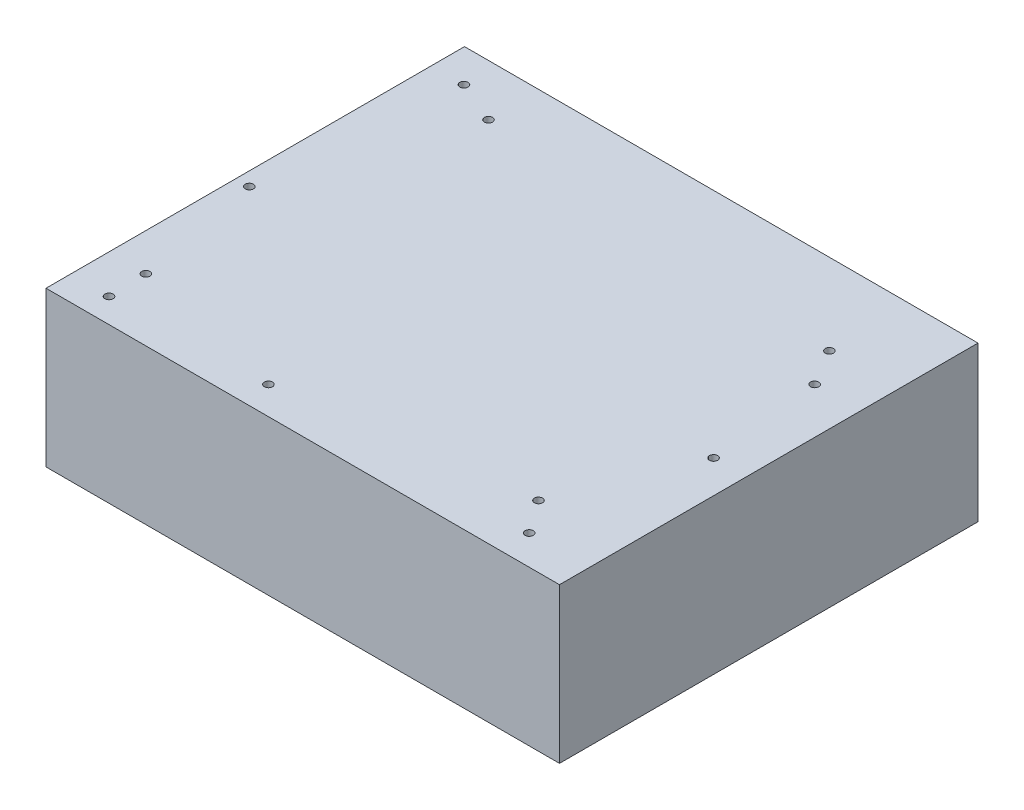
ISO-10303-21;
HEADER;
FILE_DESCRIPTION(('STEP AP214'),'2;1');
FILE_NAME('part.step','',(''),(''),'','','');
FILE_SCHEMA(('AUTOMOTIVE_DESIGN { 1 0 10303 214 1 1 1 1 }'));
ENDSEC;
DATA;
#1=APPLICATION_CONTEXT('core data for automotive mechanical design processes');
#2=APPLICATION_PROTOCOL_DEFINITION('international standard','automotive_design',2000,#1);
#3=PRODUCT_CONTEXT('',#1,'mechanical');
#4=PRODUCT('Part','Part','',(#3));
#5=PRODUCT_RELATED_PRODUCT_CATEGORY('part','',(#4));
#6=PRODUCT_DEFINITION_FORMATION('','',#4);
#7=PRODUCT_DEFINITION_CONTEXT('part definition',#1,'design');
#8=PRODUCT_DEFINITION('design','',#6,#7);
#9=PRODUCT_DEFINITION_SHAPE('','',#8);
#10=(LENGTH_UNIT() NAMED_UNIT(*) SI_UNIT(.MILLI.,.METRE.));
#11=(NAMED_UNIT(*) PLANE_ANGLE_UNIT() SI_UNIT($,.RADIAN.));
#12=(NAMED_UNIT(*) SI_UNIT($,.STERADIAN.) SOLID_ANGLE_UNIT());
#13=UNCERTAINTY_MEASURE_WITH_UNIT(LENGTH_MEASURE(1.E-05),#10,'distance_accuracy_value','');
#14=(GEOMETRIC_REPRESENTATION_CONTEXT(3) GLOBAL_UNCERTAINTY_ASSIGNED_CONTEXT((#13)) GLOBAL_UNIT_ASSIGNED_CONTEXT((#10,
#11,#12)) REPRESENTATION_CONTEXT('',''));
#15=CARTESIAN_POINT('',(0.,0.,0.));
#16=DIRECTION('',(0.,0.,1.));
#17=DIRECTION('',(1.,0.,0.));
#18=AXIS2_PLACEMENT_3D('',#15,#16,#17);
#19=CARTESIAN_POINT('',(-187.5,113.03,-170.));
#20=DIRECTION('',(0.,0.,1.));
#21=DIRECTION('',(1.,0.,0.));
#22=AXIS2_PLACEMENT_3D('',#19,#20,#21);
#23=PLANE('',#22);
#24=DIRECTION('',(-1.,0.,0.));
#25=VECTOR('',#24,1.);
#26=CARTESIAN_POINT('',(-187.5,0.,-170.));
#27=LINE('',#26,#25);
#28=CARTESIAN_POINT('',(187.5,0.,-170.));
#29=VERTEX_POINT('',#28);
#30=CARTESIAN_POINT('',(-187.5,0.,-170.));
#31=VERTEX_POINT('',#30);
#32=EDGE_CURVE('E86',#29,#31,#27,.T.);
#33=ORIENTED_EDGE('',*,*,#32,.T.);
#34=DIRECTION('',(0.,-1.,0.));
#35=VECTOR('',#34,1.);
#36=CARTESIAN_POINT('',(-187.5,113.03,-170.));
#37=LINE('',#36,#35);
#38=CARTESIAN_POINT('',(-187.5,113.03,-170.));
#39=VERTEX_POINT('',#38);
#40=EDGE_CURVE('E40',#39,#31,#37,.T.);
#41=ORIENTED_EDGE('',*,*,#40,.F.);
#42=DIRECTION('',(-1.,0.,0.));
#43=VECTOR('',#42,1.);
#44=CARTESIAN_POINT('',(-187.5,113.03,-170.));
#45=LINE('',#44,#43);
#46=CARTESIAN_POINT('',(187.5,113.03,-170.));
#47=VERTEX_POINT('',#46);
#48=EDGE_CURVE('E78',#47,#39,#45,.T.);
#49=ORIENTED_EDGE('',*,*,#48,.F.);
#50=DIRECTION('',(0.,-1.,0.));
#51=VECTOR('',#50,1.);
#52=CARTESIAN_POINT('',(187.5,113.03,-170.));
#53=LINE('',#52,#51);
#54=EDGE_CURVE('E11',#47,#29,#53,.T.);
#55=ORIENTED_EDGE('',*,*,#54,.T.);
#56=EDGE_LOOP('',(#33,#41,#49,#55));
#57=FACE_BOUND('',#56,.T.);
#58=ADVANCED_FACE('F32',(#57),#23,.F.);
#59=CARTESIAN_POINT('',(-187.5,113.03,-150.));
#60=DIRECTION('',(1.,0.,0.));
#61=DIRECTION('',(0.,0.,-1.));
#62=AXIS2_PLACEMENT_3D('',#59,#60,#61);
#63=PLANE('',#62);
#64=DIRECTION('',(0.,0.,1.));
#65=VECTOR('',#64,1.);
#66=CARTESIAN_POINT('',(-187.5,0.,-150.));
#67=LINE('',#66,#65);
#68=CARTESIAN_POINT('',(-187.5,0.,135.64242453302));
#69=VERTEX_POINT('',#68);
#70=EDGE_CURVE('E65',#31,#69,#67,.T.);
#71=ORIENTED_EDGE('',*,*,#70,.T.);
#72=DIRECTION('',(0.,-1.,0.));
#73=VECTOR('',#72,1.);
#74=CARTESIAN_POINT('',(-187.5,113.03,135.64242453302));
#75=LINE('',#74,#73);
#76=CARTESIAN_POINT('',(-187.5,113.03,135.64242453302));
#77=VERTEX_POINT('',#76);
#78=EDGE_CURVE('E87',#77,#69,#75,.T.);
#79=ORIENTED_EDGE('',*,*,#78,.F.);
#80=DIRECTION('',(0.,0.,1.));
#81=VECTOR('',#80,1.);
#82=CARTESIAN_POINT('',(-187.5,113.03,-150.));
#83=LINE('',#82,#81);
#84=EDGE_CURVE('E82',#39,#77,#83,.T.);
#85=ORIENTED_EDGE('',*,*,#84,.F.);
#86=ORIENTED_EDGE('',*,*,#40,.T.);
#87=EDGE_LOOP('',(#71,#79,#85,#86));
#88=FACE_BOUND('',#87,.T.);
#89=ADVANCED_FACE('F88',(#88),#63,.F.);
#90=CARTESIAN_POINT('',(-187.5,113.03,135.64242453302));
#91=DIRECTION('',(0.,0.,-1.));
#92=DIRECTION('',(-1.,0.,0.));
#93=AXIS2_PLACEMENT_3D('',#90,#91,#92);
#94=PLANE('',#93);
#95=DIRECTION('',(1.,0.,0.));
#96=VECTOR('',#95,1.);
#97=CARTESIAN_POINT('',(-187.5,0.,135.64242453302));
#98=LINE('',#97,#96);
#99=CARTESIAN_POINT('',(187.5,0.,135.64242453302));
#100=VERTEX_POINT('',#99);
#101=EDGE_CURVE('E72',#69,#100,#98,.T.);
#102=ORIENTED_EDGE('',*,*,#101,.T.);
#103=DIRECTION('',(0.,-1.,0.));
#104=VECTOR('',#103,1.);
#105=CARTESIAN_POINT('',(187.5,113.03,135.64242453302));
#106=LINE('',#105,#104);
#107=CARTESIAN_POINT('',(187.5,113.03,135.64242453302));
#108=VERTEX_POINT('',#107);
#109=EDGE_CURVE('E92',#108,#100,#106,.T.);
#110=ORIENTED_EDGE('',*,*,#109,.F.);
#111=DIRECTION('',(1.,0.,0.));
#112=VECTOR('',#111,1.);
#113=CARTESIAN_POINT('',(-187.5,113.03,135.64242453302));
#114=LINE('',#113,#112);
#115=EDGE_CURVE('E90',#77,#108,#114,.T.);
#116=ORIENTED_EDGE('',*,*,#115,.F.);
#117=ORIENTED_EDGE('',*,*,#78,.T.);
#118=EDGE_LOOP('',(#102,#110,#116,#117));
#119=FACE_BOUND('',#118,.T.);
#120=ADVANCED_FACE('F103',(#119),#94,.F.);
#121=CARTESIAN_POINT('',(187.5,113.03,-152.769842225601));
#122=DIRECTION('',(-1.,0.,0.));
#123=DIRECTION('',(0.,0.,1.));
#124=AXIS2_PLACEMENT_3D('',#121,#122,#123);
#125=PLANE('',#124);
#126=DIRECTION('',(0.,0.,-1.));
#127=VECTOR('',#126,1.);
#128=CARTESIAN_POINT('',(187.5,0.,-152.769842225601));
#129=LINE('',#128,#127);
#130=EDGE_CURVE('E100',#100,#29,#129,.T.);
#131=ORIENTED_EDGE('',*,*,#130,.T.);
#132=ORIENTED_EDGE('',*,*,#54,.F.);
#133=DIRECTION('',(0.,0.,-1.));
#134=VECTOR('',#133,1.);
#135=CARTESIAN_POINT('',(187.5,113.03,-170.));
#136=LINE('',#135,#134);
#137=EDGE_CURVE('E48',#108,#47,#136,.T.);
#138=ORIENTED_EDGE('',*,*,#137,.F.);
#139=ORIENTED_EDGE('',*,*,#109,.T.);
#140=EDGE_LOOP('',(#131,#132,#138,#139));
#141=FACE_BOUND('',#140,.T.);
#142=ADVANCED_FACE('F107',(#141),#125,.F.);
#143=CARTESIAN_POINT('',(0.,113.03,0.));
#144=DIRECTION('',(0.,1.,0.));
#145=DIRECTION('',(0.,0.,1.));
#146=AXIS2_PLACEMENT_3D('',#143,#144,#145);
#147=PLANE('',#146);
#148=CARTESIAN_POINT('',(-163.609115423291,113.03,-145.69581866178));
#149=DIRECTION('',(0.,1.,0.));
#150=DIRECTION('',(0.,0.,1.));
#151=AXIS2_PLACEMENT_3D('',#148,#149,#150);
#152=CIRCLE('',#151,2.99999999999999);
#153=CARTESIAN_POINT('',(-163.609115423291,113.03,-142.69581866178));
#154=VERTEX_POINT('',#153);
#155=EDGE_CURVE('E372',#154,#154,#152,.T.);
#156=ORIENTED_EDGE('',*,*,#155,.F.);
#157=EDGE_LOOP('',(#156));
#158=FACE_BOUND('',#157,.T.);
#159=CARTESIAN_POINT('',(138.154047488741,113.03,-110.820373833474));
#160=DIRECTION('',(0.,1.,0.));
#161=DIRECTION('',(0.,0.,1.));
#162=AXIS2_PLACEMENT_3D('',#159,#160,#161);
#163=CIRCLE('',#162,2.99999999999999);
#164=CARTESIAN_POINT('',(138.154047488741,113.03,-107.820373833474));
#165=VERTEX_POINT('',#164);
#166=EDGE_CURVE('E385',#165,#165,#163,.T.);
#167=ORIENTED_EDGE('',*,*,#166,.F.);
#168=EDGE_LOOP('',(#167));
#169=FACE_BOUND('',#168,.T.);
#170=CARTESIAN_POINT('',(154.00924784544,113.03,-84.2079476278883));
#171=DIRECTION('',(0.,1.,0.));
#172=DIRECTION('',(0.,0.,1.));
#173=AXIS2_PLACEMENT_3D('',#170,#171,#172);
#174=CIRCLE('',#173,2.99999999999999);
#175=CARTESIAN_POINT('',(154.00924784544,113.03,-81.2079476278883));
#176=VERTEX_POINT('',#175);
#177=EDGE_CURVE('E378',#176,#176,#174,.T.);
#178=ORIENTED_EDGE('',*,*,#177,.F.);
#179=EDGE_LOOP('',(#178));
#180=FACE_BOUND('',#179,.T.);
#181=CARTESIAN_POINT('',(163.603739252658,113.03,-0.788099456570386));
#182=DIRECTION('',(0.,1.,0.));
#183=DIRECTION('',(0.,0.,1.));
#184=AXIS2_PLACEMENT_3D('',#181,#182,#183);
#185=CIRCLE('',#184,2.99999999999999);
#186=CARTESIAN_POINT('',(163.603739252658,113.03,2.21190054342961));
#187=VERTEX_POINT('',#186);
#188=EDGE_CURVE('E432',#187,#187,#185,.T.);
#189=ORIENTED_EDGE('',*,*,#188,.F.);
#190=EDGE_LOOP('',(#189));
#191=FACE_BOUND('',#190,.T.);
#192=CARTESIAN_POINT('',(126.5470157298,113.03,90.0363963788493));
#193=DIRECTION('',(0.,1.,0.));
#194=DIRECTION('',(0.,0.,1.));
#195=AXIS2_PLACEMENT_3D('',#192,#193,#194);
#196=CIRCLE('',#195,2.99999999999999);
#197=CARTESIAN_POINT('',(126.5470157298,113.03,93.0363963788493));
#198=VERTEX_POINT('',#197);
#199=EDGE_CURVE('E426',#198,#198,#196,.T.);
#200=ORIENTED_EDGE('',*,*,#199,.F.);
#201=EDGE_LOOP('',(#200));
#202=FACE_BOUND('',#201,.T.);
#203=CARTESIAN_POINT('',(143.753799676271,113.03,114.029801923348));
#204=DIRECTION('',(0.,1.,0.));
#205=DIRECTION('',(0.,0.,1.));
#206=AXIS2_PLACEMENT_3D('',#203,#204,#205);
#207=CIRCLE('',#206,2.99999999999999);
#208=CARTESIAN_POINT('',(143.753799676271,113.03,117.029801923348));
#209=VERTEX_POINT('',#208);
#210=EDGE_CURVE('E420',#209,#209,#207,.T.);
#211=ORIENTED_EDGE('',*,*,#210,.F.);
#212=EDGE_LOOP('',(#211));
#213=FACE_BOUND('',#212,.T.);
#214=CARTESIAN_POINT('',(-45.4503723314891,113.03,115.251672549041));
#215=DIRECTION('',(0.,1.,0.));
#216=DIRECTION('',(0.,0.,1.));
#217=AXIS2_PLACEMENT_3D('',#214,#215,#216);
#218=CIRCLE('',#217,3.);
#219=CARTESIAN_POINT('',(-45.4503723314891,113.03,118.251672549041));
#220=VERTEX_POINT('',#219);
#221=EDGE_CURVE('E414',#220,#220,#218,.T.);
#222=ORIENTED_EDGE('',*,*,#221,.F.);
#223=EDGE_LOOP('',(#222));
#224=FACE_BOUND('',#223,.T.);
#225=CARTESIAN_POINT('',(-159.322465717758,113.03,117.822298668571));
#226=DIRECTION('',(0.,1.,0.));
#227=DIRECTION('',(0.,0.,1.));
#228=AXIS2_PLACEMENT_3D('',#225,#226,#227);
#229=CIRCLE('',#228,2.99999999999999);
#230=CARTESIAN_POINT('',(-159.322465717758,113.03,120.822298668571));
#231=VERTEX_POINT('',#230);
#232=EDGE_CURVE('E408',#231,#231,#229,.T.);
#233=ORIENTED_EDGE('',*,*,#232,.F.);
#234=EDGE_LOOP('',(#233));
#235=FACE_BOUND('',#234,.T.);
#236=CARTESIAN_POINT('',(-160.1588842702,113.03,90.0363963788493));
#237=DIRECTION('',(0.,1.,0.));
#238=DIRECTION('',(0.,0.,1.));
#239=AXIS2_PLACEMENT_3D('',#236,#237,#238);
#240=CIRCLE('',#239,2.99999999999999);
#241=CARTESIAN_POINT('',(-160.1588842702,113.03,93.0363963788493));
#242=VERTEX_POINT('',#241);
#243=EDGE_CURVE('E402',#242,#242,#240,.T.);
#244=ORIENTED_EDGE('',*,*,#243,.F.);
#245=EDGE_LOOP('',(#244));
#246=FACE_BOUND('',#245,.T.);
#247=CARTESIAN_POINT('',(-177.548814269973,113.03,-2.91478574500423));
#248=DIRECTION('',(0.,1.,0.));
#249=DIRECTION('',(0.,0.,1.));
#250=AXIS2_PLACEMENT_3D('',#247,#248,#249);
#251=CIRCLE('',#250,2.99999999999999);
#252=CARTESIAN_POINT('',(-177.548814269973,113.03,0.0852142549957664));
#253=VERTEX_POINT('',#252);
#254=EDGE_CURVE('E396',#253,#253,#251,.T.);
#255=ORIENTED_EDGE('',*,*,#254,.F.);
#256=EDGE_LOOP('',(#255));
#257=FACE_BOUND('',#256,.T.);
#258=CARTESIAN_POINT('',(-132.455839764983,113.03,-132.467571364947));
#259=DIRECTION('',(0.,1.,0.));
#260=DIRECTION('',(0.,0.,1.));
#261=AXIS2_PLACEMENT_3D('',#258,#259,#260);
#262=CIRCLE('',#261,2.99999999999999);
#263=CARTESIAN_POINT('',(-132.455839764983,113.03,-129.467571364947));
#264=VERTEX_POINT('',#263);
#265=EDGE_CURVE('E375',#264,#264,#262,.T.);
#266=ORIENTED_EDGE('',*,*,#265,.F.);
#267=EDGE_LOOP('',(#266));
#268=FACE_BOUND('',#267,.T.);
#269=ORIENTED_EDGE('',*,*,#137,.T.);
#270=ORIENTED_EDGE('',*,*,#48,.T.);
#271=ORIENTED_EDGE('',*,*,#84,.T.);
#272=ORIENTED_EDGE('',*,*,#115,.T.);
#273=EDGE_LOOP('',(#269,#270,#271,#272));
#274=FACE_BOUND('',#273,.T.);
#275=ADVANCED_FACE('F80',(#158,#169,#180,#191,#202,#213,#224,#235,#246,#257,#268,#274),#147,.T.);
#276=CARTESIAN_POINT('',(0.,0.,0.));
#277=DIRECTION('',(0.,1.,0.));
#278=DIRECTION('',(0.,0.,1.));
#279=AXIS2_PLACEMENT_3D('',#276,#277,#278);
#280=PLANE('',#279);
#281=ORIENTED_EDGE('',*,*,#32,.F.);
#282=ORIENTED_EDGE('',*,*,#130,.F.);
#283=ORIENTED_EDGE('',*,*,#101,.F.);
#284=ORIENTED_EDGE('',*,*,#70,.F.);
#285=EDGE_LOOP('',(#281,#282,#283,#284));
#286=FACE_BOUND('',#285,.T.);
#287=ADVANCED_FACE('F106',(#286),#280,.F.);
#288=CARTESIAN_POINT('',(-132.455839764983,93.03,-132.467571364947));
#289=DIRECTION('',(0.,1.,0.));
#290=DIRECTION('',(0.,0.,1.));
#291=AXIS2_PLACEMENT_3D('',#288,#289,#290);
#292=CYLINDRICAL_SURFACE('',#291,2.99999999999999);
#293=CARTESIAN_POINT('',(-132.455839764983,93.03,-132.467571364947));
#294=DIRECTION('',(0.,1.,0.));
#295=DIRECTION('',(0.,0.,1.));
#296=AXIS2_PLACEMENT_3D('',#293,#294,#295);
#297=CIRCLE('',#296,2.99999999999999);
#298=CARTESIAN_POINT('',(-132.455839764983,93.03,-129.467571364947));
#299=VERTEX_POINT('',#298);
#300=EDGE_CURVE('E393',#299,#299,#297,.T.);
#301=ORIENTED_EDGE('',*,*,#300,.F.);
#302=EDGE_LOOP('',(#301));
#303=FACE_BOUND('',#302,.T.);
#304=ORIENTED_EDGE('',*,*,#265,.T.);
#305=EDGE_LOOP('',(#304));
#306=FACE_BOUND('',#305,.T.);
#307=ADVANCED_FACE('F143',(#303,#306),#292,.F.);
#308=CARTESIAN_POINT('',(-132.455839764983,93.03,-132.467571364947));
#309=DIRECTION('',(0.,1.,0.));
#310=DIRECTION('',(0.,0.,1.));
#311=AXIS2_PLACEMENT_3D('',#308,#309,#310);
#312=PLANE('',#311);
#313=ORIENTED_EDGE('',*,*,#300,.T.);
#314=EDGE_LOOP('',(#313));
#315=FACE_BOUND('',#314,.T.);
#316=ADVANCED_FACE('F156',(#315),#312,.T.);
#317=CARTESIAN_POINT('',(-177.548814269973,93.03,-2.91478574500423));
#318=DIRECTION('',(0.,1.,0.));
#319=DIRECTION('',(0.,0.,1.));
#320=AXIS2_PLACEMENT_3D('',#317,#318,#319);
#321=CYLINDRICAL_SURFACE('',#320,2.99999999999999);
#322=CARTESIAN_POINT('',(-177.548814269973,93.03,-2.91478574500423));
#323=DIRECTION('',(0.,1.,0.));
#324=DIRECTION('',(0.,0.,1.));
#325=AXIS2_PLACEMENT_3D('',#322,#323,#324);
#326=CIRCLE('',#325,2.99999999999999);
#327=CARTESIAN_POINT('',(-177.548814269973,93.03,0.0852142549957664));
#328=VERTEX_POINT('',#327);
#329=EDGE_CURVE('E399',#328,#328,#326,.T.);
#330=ORIENTED_EDGE('',*,*,#329,.F.);
#331=EDGE_LOOP('',(#330));
#332=FACE_BOUND('',#331,.T.);
#333=ORIENTED_EDGE('',*,*,#254,.T.);
#334=EDGE_LOOP('',(#333));
#335=FACE_BOUND('',#334,.T.);
#336=ADVANCED_FACE('F166',(#332,#335),#321,.F.);
#337=CARTESIAN_POINT('',(-177.548814269973,93.03,-2.91478574500423));
#338=DIRECTION('',(0.,1.,0.));
#339=DIRECTION('',(0.,0.,1.));
#340=AXIS2_PLACEMENT_3D('',#337,#338,#339);
#341=PLANE('',#340);
#342=ORIENTED_EDGE('',*,*,#329,.T.);
#343=EDGE_LOOP('',(#342));
#344=FACE_BOUND('',#343,.T.);
#345=ADVANCED_FACE('F176',(#344),#341,.T.);
#346=CARTESIAN_POINT('',(-160.1588842702,93.03,90.0363963788493));
#347=DIRECTION('',(0.,1.,0.));
#348=DIRECTION('',(0.,0.,1.));
#349=AXIS2_PLACEMENT_3D('',#346,#347,#348);
#350=CYLINDRICAL_SURFACE('',#349,2.99999999999999);
#351=CARTESIAN_POINT('',(-160.1588842702,93.03,90.0363963788493));
#352=DIRECTION('',(0.,1.,0.));
#353=DIRECTION('',(0.,0.,1.));
#354=AXIS2_PLACEMENT_3D('',#351,#352,#353);
#355=CIRCLE('',#354,2.99999999999999);
#356=CARTESIAN_POINT('',(-160.1588842702,93.03,93.0363963788493));
#357=VERTEX_POINT('',#356);
#358=EDGE_CURVE('E405',#357,#357,#355,.T.);
#359=ORIENTED_EDGE('',*,*,#358,.F.);
#360=EDGE_LOOP('',(#359));
#361=FACE_BOUND('',#360,.T.);
#362=ORIENTED_EDGE('',*,*,#243,.T.);
#363=EDGE_LOOP('',(#362));
#364=FACE_BOUND('',#363,.T.);
#365=ADVANCED_FACE('F186',(#361,#364),#350,.F.);
#366=CARTESIAN_POINT('',(-160.1588842702,93.03,90.0363963788493));
#367=DIRECTION('',(0.,1.,0.));
#368=DIRECTION('',(0.,0.,1.));
#369=AXIS2_PLACEMENT_3D('',#366,#367,#368);
#370=PLANE('',#369);
#371=ORIENTED_EDGE('',*,*,#358,.T.);
#372=EDGE_LOOP('',(#371));
#373=FACE_BOUND('',#372,.T.);
#374=ADVANCED_FACE('F196',(#373),#370,.T.);
#375=CARTESIAN_POINT('',(-159.322465717758,93.03,117.822298668571));
#376=DIRECTION('',(0.,1.,0.));
#377=DIRECTION('',(0.,0.,1.));
#378=AXIS2_PLACEMENT_3D('',#375,#376,#377);
#379=CYLINDRICAL_SURFACE('',#378,2.99999999999999);
#380=CARTESIAN_POINT('',(-159.322465717758,93.03,117.822298668571));
#381=DIRECTION('',(0.,1.,0.));
#382=DIRECTION('',(0.,0.,1.));
#383=AXIS2_PLACEMENT_3D('',#380,#381,#382);
#384=CIRCLE('',#383,2.99999999999999);
#385=CARTESIAN_POINT('',(-159.322465717758,93.03,120.822298668571));
#386=VERTEX_POINT('',#385);
#387=EDGE_CURVE('E411',#386,#386,#384,.T.);
#388=ORIENTED_EDGE('',*,*,#387,.F.);
#389=EDGE_LOOP('',(#388));
#390=FACE_BOUND('',#389,.T.);
#391=ORIENTED_EDGE('',*,*,#232,.T.);
#392=EDGE_LOOP('',(#391));
#393=FACE_BOUND('',#392,.T.);
#394=ADVANCED_FACE('F206',(#390,#393),#379,.F.);
#395=CARTESIAN_POINT('',(-159.322465717758,93.03,117.822298668571));
#396=DIRECTION('',(0.,1.,0.));
#397=DIRECTION('',(0.,0.,1.));
#398=AXIS2_PLACEMENT_3D('',#395,#396,#397);
#399=PLANE('',#398);
#400=ORIENTED_EDGE('',*,*,#387,.T.);
#401=EDGE_LOOP('',(#400));
#402=FACE_BOUND('',#401,.T.);
#403=ADVANCED_FACE('F216',(#402),#399,.T.);
#404=CARTESIAN_POINT('',(-45.4503723314891,93.03,115.251672549041));
#405=DIRECTION('',(0.,1.,0.));
#406=DIRECTION('',(0.,0.,1.));
#407=AXIS2_PLACEMENT_3D('',#404,#405,#406);
#408=CYLINDRICAL_SURFACE('',#407,3.);
#409=CARTESIAN_POINT('',(-45.4503723314891,93.03,115.251672549041));
#410=DIRECTION('',(0.,1.,0.));
#411=DIRECTION('',(0.,0.,1.));
#412=AXIS2_PLACEMENT_3D('',#409,#410,#411);
#413=CIRCLE('',#412,3.);
#414=CARTESIAN_POINT('',(-45.4503723314891,93.03,118.251672549041));
#415=VERTEX_POINT('',#414);
#416=EDGE_CURVE('E417',#415,#415,#413,.T.);
#417=ORIENTED_EDGE('',*,*,#416,.F.);
#418=EDGE_LOOP('',(#417));
#419=FACE_BOUND('',#418,.T.);
#420=ORIENTED_EDGE('',*,*,#221,.T.);
#421=EDGE_LOOP('',(#420));
#422=FACE_BOUND('',#421,.T.);
#423=ADVANCED_FACE('F226',(#419,#422),#408,.F.);
#424=CARTESIAN_POINT('',(-45.4503723314891,93.03,115.251672549041));
#425=DIRECTION('',(0.,1.,0.));
#426=DIRECTION('',(0.,0.,1.));
#427=AXIS2_PLACEMENT_3D('',#424,#425,#426);
#428=PLANE('',#427);
#429=ORIENTED_EDGE('',*,*,#416,.T.);
#430=EDGE_LOOP('',(#429));
#431=FACE_BOUND('',#430,.T.);
#432=ADVANCED_FACE('F236',(#431),#428,.T.);
#433=CARTESIAN_POINT('',(143.753799676271,93.03,114.029801923348));
#434=DIRECTION('',(0.,1.,0.));
#435=DIRECTION('',(0.,0.,1.));
#436=AXIS2_PLACEMENT_3D('',#433,#434,#435);
#437=CYLINDRICAL_SURFACE('',#436,2.99999999999999);
#438=CARTESIAN_POINT('',(143.753799676271,93.03,114.029801923348));
#439=DIRECTION('',(0.,1.,0.));
#440=DIRECTION('',(0.,0.,1.));
#441=AXIS2_PLACEMENT_3D('',#438,#439,#440);
#442=CIRCLE('',#441,2.99999999999999);
#443=CARTESIAN_POINT('',(143.753799676271,93.03,117.029801923348));
#444=VERTEX_POINT('',#443);
#445=EDGE_CURVE('E423',#444,#444,#442,.T.);
#446=ORIENTED_EDGE('',*,*,#445,.F.);
#447=EDGE_LOOP('',(#446));
#448=FACE_BOUND('',#447,.T.);
#449=ORIENTED_EDGE('',*,*,#210,.T.);
#450=EDGE_LOOP('',(#449));
#451=FACE_BOUND('',#450,.T.);
#452=ADVANCED_FACE('F246',(#448,#451),#437,.F.);
#453=CARTESIAN_POINT('',(143.753799676271,93.03,114.029801923348));
#454=DIRECTION('',(0.,1.,0.));
#455=DIRECTION('',(0.,0.,1.));
#456=AXIS2_PLACEMENT_3D('',#453,#454,#455);
#457=PLANE('',#456);
#458=ORIENTED_EDGE('',*,*,#445,.T.);
#459=EDGE_LOOP('',(#458));
#460=FACE_BOUND('',#459,.T.);
#461=ADVANCED_FACE('F256',(#460),#457,.T.);
#462=CARTESIAN_POINT('',(126.5470157298,93.03,90.0363963788493));
#463=DIRECTION('',(0.,1.,0.));
#464=DIRECTION('',(0.,0.,1.));
#465=AXIS2_PLACEMENT_3D('',#462,#463,#464);
#466=CYLINDRICAL_SURFACE('',#465,2.99999999999999);
#467=CARTESIAN_POINT('',(126.5470157298,93.03,90.0363963788493));
#468=DIRECTION('',(0.,1.,0.));
#469=DIRECTION('',(0.,0.,1.));
#470=AXIS2_PLACEMENT_3D('',#467,#468,#469);
#471=CIRCLE('',#470,2.99999999999999);
#472=CARTESIAN_POINT('',(126.5470157298,93.03,93.0363963788493));
#473=VERTEX_POINT('',#472);
#474=EDGE_CURVE('E429',#473,#473,#471,.T.);
#475=ORIENTED_EDGE('',*,*,#474,.F.);
#476=EDGE_LOOP('',(#475));
#477=FACE_BOUND('',#476,.T.);
#478=ORIENTED_EDGE('',*,*,#199,.T.);
#479=EDGE_LOOP('',(#478));
#480=FACE_BOUND('',#479,.T.);
#481=ADVANCED_FACE('F266',(#477,#480),#466,.F.);
#482=CARTESIAN_POINT('',(126.5470157298,93.03,90.0363963788493));
#483=DIRECTION('',(0.,1.,0.));
#484=DIRECTION('',(0.,0.,1.));
#485=AXIS2_PLACEMENT_3D('',#482,#483,#484);
#486=PLANE('',#485);
#487=ORIENTED_EDGE('',*,*,#474,.T.);
#488=EDGE_LOOP('',(#487));
#489=FACE_BOUND('',#488,.T.);
#490=ADVANCED_FACE('F276',(#489),#486,.T.);
#491=CARTESIAN_POINT('',(163.603739252658,93.03,-0.788099456570386));
#492=DIRECTION('',(0.,1.,0.));
#493=DIRECTION('',(0.,0.,1.));
#494=AXIS2_PLACEMENT_3D('',#491,#492,#493);
#495=CYLINDRICAL_SURFACE('',#494,2.99999999999999);
#496=CARTESIAN_POINT('',(163.603739252658,93.03,-0.788099456570386));
#497=DIRECTION('',(0.,1.,0.));
#498=DIRECTION('',(0.,0.,1.));
#499=AXIS2_PLACEMENT_3D('',#496,#497,#498);
#500=CIRCLE('',#499,2.99999999999999);
#501=CARTESIAN_POINT('',(163.603739252658,93.03,2.21190054342961));
#502=VERTEX_POINT('',#501);
#503=EDGE_CURVE('E381',#502,#502,#500,.T.);
#504=ORIENTED_EDGE('',*,*,#503,.F.);
#505=EDGE_LOOP('',(#504));
#506=FACE_BOUND('',#505,.T.);
#507=ORIENTED_EDGE('',*,*,#188,.T.);
#508=EDGE_LOOP('',(#507));
#509=FACE_BOUND('',#508,.T.);
#510=ADVANCED_FACE('F286',(#506,#509),#495,.F.);
#511=CARTESIAN_POINT('',(163.603739252658,93.03,-0.788099456570386));
#512=DIRECTION('',(0.,1.,0.));
#513=DIRECTION('',(0.,0.,1.));
#514=AXIS2_PLACEMENT_3D('',#511,#512,#513);
#515=PLANE('',#514);
#516=ORIENTED_EDGE('',*,*,#503,.T.);
#517=EDGE_LOOP('',(#516));
#518=FACE_BOUND('',#517,.T.);
#519=ADVANCED_FACE('F296',(#518),#515,.T.);
#520=CARTESIAN_POINT('',(154.00924784544,93.03,-84.2079476278883));
#521=DIRECTION('',(0.,1.,0.));
#522=DIRECTION('',(0.,0.,1.));
#523=AXIS2_PLACEMENT_3D('',#520,#521,#522);
#524=CYLINDRICAL_SURFACE('',#523,2.99999999999999);
#525=CARTESIAN_POINT('',(154.00924784544,93.03,-84.2079476278883));
#526=DIRECTION('',(0.,1.,0.));
#527=DIRECTION('',(0.,0.,1.));
#528=AXIS2_PLACEMENT_3D('',#525,#526,#527);
#529=CIRCLE('',#528,2.99999999999999);
#530=CARTESIAN_POINT('',(154.00924784544,93.03,-81.2079476278883));
#531=VERTEX_POINT('',#530);
#532=EDGE_CURVE('E382',#531,#531,#529,.T.);
#533=ORIENTED_EDGE('',*,*,#532,.F.);
#534=EDGE_LOOP('',(#533));
#535=FACE_BOUND('',#534,.T.);
#536=ORIENTED_EDGE('',*,*,#177,.T.);
#537=EDGE_LOOP('',(#536));
#538=FACE_BOUND('',#537,.T.);
#539=ADVANCED_FACE('F306',(#535,#538),#524,.F.);
#540=CARTESIAN_POINT('',(154.00924784544,93.03,-84.2079476278883));
#541=DIRECTION('',(0.,1.,0.));
#542=DIRECTION('',(0.,0.,1.));
#543=AXIS2_PLACEMENT_3D('',#540,#541,#542);
#544=PLANE('',#543);
#545=ORIENTED_EDGE('',*,*,#532,.T.);
#546=EDGE_LOOP('',(#545));
#547=FACE_BOUND('',#546,.T.);
#548=ADVANCED_FACE('F316',(#547),#544,.T.);
#549=CARTESIAN_POINT('',(138.154047488741,93.03,-110.820373833474));
#550=DIRECTION('',(0.,1.,0.));
#551=DIRECTION('',(0.,0.,1.));
#552=AXIS2_PLACEMENT_3D('',#549,#550,#551);
#553=CYLINDRICAL_SURFACE('',#552,2.99999999999999);
#554=CARTESIAN_POINT('',(138.154047488741,93.03,-110.820373833474));
#555=DIRECTION('',(0.,1.,0.));
#556=DIRECTION('',(0.,0.,1.));
#557=AXIS2_PLACEMENT_3D('',#554,#555,#556);
#558=CIRCLE('',#557,2.99999999999999);
#559=CARTESIAN_POINT('',(138.154047488741,93.03,-107.820373833474));
#560=VERTEX_POINT('',#559);
#561=EDGE_CURVE('E388',#560,#560,#558,.T.);
#562=ORIENTED_EDGE('',*,*,#561,.F.);
#563=EDGE_LOOP('',(#562));
#564=FACE_BOUND('',#563,.T.);
#565=ORIENTED_EDGE('',*,*,#166,.T.);
#566=EDGE_LOOP('',(#565));
#567=FACE_BOUND('',#566,.T.);
#568=ADVANCED_FACE('F326',(#564,#567),#553,.F.);
#569=CARTESIAN_POINT('',(138.154047488741,93.03,-110.820373833474));
#570=DIRECTION('',(0.,1.,0.));
#571=DIRECTION('',(0.,0.,1.));
#572=AXIS2_PLACEMENT_3D('',#569,#570,#571);
#573=PLANE('',#572);
#574=ORIENTED_EDGE('',*,*,#561,.T.);
#575=EDGE_LOOP('',(#574));
#576=FACE_BOUND('',#575,.T.);
#577=ADVANCED_FACE('F336',(#576),#573,.T.);
#578=CARTESIAN_POINT('',(-163.609115423291,93.03,-145.69581866178));
#579=DIRECTION('',(0.,1.,0.));
#580=DIRECTION('',(0.,0.,1.));
#581=AXIS2_PLACEMENT_3D('',#578,#579,#580);
#582=CYLINDRICAL_SURFACE('',#581,2.99999999999999);
#583=CARTESIAN_POINT('',(-163.609115423291,93.03,-145.69581866178));
#584=DIRECTION('',(0.,1.,0.));
#585=DIRECTION('',(0.,0.,1.));
#586=AXIS2_PLACEMENT_3D('',#583,#584,#585);
#587=CIRCLE('',#586,2.99999999999999);
#588=CARTESIAN_POINT('',(-163.609115423291,93.03,-142.69581866178));
#589=VERTEX_POINT('',#588);
#590=EDGE_CURVE('E97',#589,#589,#587,.T.);
#591=ORIENTED_EDGE('',*,*,#590,.F.);
#592=EDGE_LOOP('',(#591));
#593=FACE_BOUND('',#592,.T.);
#594=ORIENTED_EDGE('',*,*,#155,.T.);
#595=EDGE_LOOP('',(#594));
#596=FACE_BOUND('',#595,.T.);
#597=ADVANCED_FACE('F346',(#593,#596),#582,.F.);
#598=CARTESIAN_POINT('',(0.,93.03,0.));
#599=DIRECTION('',(0.,1.,0.));
#600=DIRECTION('',(0.,0.,1.));
#601=AXIS2_PLACEMENT_3D('',#598,#599,#600);
#602=PLANE('',#601);
#603=ORIENTED_EDGE('',*,*,#590,.T.);
#604=EDGE_LOOP('',(#603));
#605=FACE_BOUND('',#604,.T.);
#606=ADVANCED_FACE('F356',(#605),#602,.T.);
#607=CLOSED_SHELL('',(#58,#89,#120,#142,#275,#287,#307,#316,#336,#345,#365,#374,#394,#403,#423,
#432,#452,#461,#481,#490,#510,#519,#539,#548,#568,#577,#597,#606));
#608=MANIFOLD_SOLID_BREP('B2',#607);
#609=ADVANCED_BREP_SHAPE_REPRESENTATION('',(#18,#608),#14);
#610=SHAPE_DEFINITION_REPRESENTATION(#9,#609);
ENDSEC;
END-ISO-10303-21;
